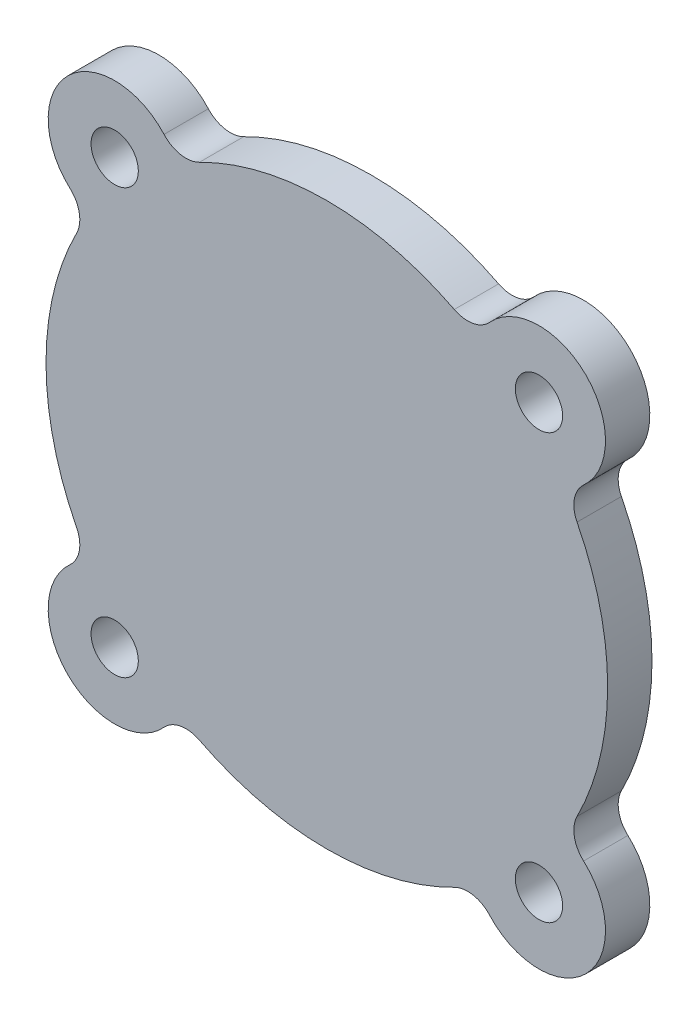
ISO-10303-21;
HEADER;
FILE_DESCRIPTION(('STEP AP214'),'2;1');
FILE_NAME('part.step','',(''),(''),'','','');
FILE_SCHEMA(('AUTOMOTIVE_DESIGN { 1 0 10303 214 1 1 1 1 }'));
ENDSEC;
DATA;
#1=APPLICATION_CONTEXT('core data for automotive mechanical design processes');
#2=APPLICATION_PROTOCOL_DEFINITION('international standard','automotive_design',2000,#1);
#3=PRODUCT_CONTEXT('',#1,'mechanical');
#4=PRODUCT('Part','Part','',(#3));
#5=PRODUCT_RELATED_PRODUCT_CATEGORY('part','',(#4));
#6=PRODUCT_DEFINITION_FORMATION('','',#4);
#7=PRODUCT_DEFINITION_CONTEXT('part definition',#1,'design');
#8=PRODUCT_DEFINITION('design','',#6,#7);
#9=PRODUCT_DEFINITION_SHAPE('','',#8);
#10=(LENGTH_UNIT() NAMED_UNIT(*) SI_UNIT(.MILLI.,.METRE.));
#11=(NAMED_UNIT(*) PLANE_ANGLE_UNIT() SI_UNIT($,.RADIAN.));
#12=(NAMED_UNIT(*) SI_UNIT($,.STERADIAN.) SOLID_ANGLE_UNIT());
#13=UNCERTAINTY_MEASURE_WITH_UNIT(LENGTH_MEASURE(1.E-05),#10,'distance_accuracy_value','');
#14=(GEOMETRIC_REPRESENTATION_CONTEXT(3) GLOBAL_UNCERTAINTY_ASSIGNED_CONTEXT((#13)) GLOBAL_UNIT_ASSIGNED_CONTEXT((#10,
#11,#12)) REPRESENTATION_CONTEXT('',''));
#15=CARTESIAN_POINT('',(0.,0.,0.));
#16=DIRECTION('',(0.,0.,1.));
#17=DIRECTION('',(1.,0.,0.));
#18=AXIS2_PLACEMENT_3D('',#15,#16,#17);
#19=CARTESIAN_POINT('',(0.,0.,3.));
#20=DIRECTION('',(0.,0.,-1.));
#21=DIRECTION('',(-1.,0.,0.));
#22=AXIS2_PLACEMENT_3D('',#19,#20,#21);
#23=CYLINDRICAL_SURFACE('',#22,19.);
#24=CARTESIAN_POINT('',(0.,0.,3.));
#25=DIRECTION('',(0.,0.,1.));
#26=DIRECTION('',(1.,0.,0.));
#27=AXIS2_PLACEMENT_3D('',#24,#25,#26);
#28=CIRCLE('',#27,19.);
#29=CARTESIAN_POINT('',(-16.9301315758226,8.62384165122102,3.));
#30=VERTEX_POINT('',#29);
#31=CARTESIAN_POINT('',(-16.9301315758226,-8.62384165122109,3.));
#32=VERTEX_POINT('',#31);
#33=EDGE_CURVE('E192',#30,#32,#28,.T.);
#34=ORIENTED_EDGE('',*,*,#33,.F.);
#35=DIRECTION('',(0.,0.,-1.));
#36=VECTOR('',#35,1.);
#37=CARTESIAN_POINT('',(-16.9301315758226,8.62384165122102,3.));
#38=LINE('',#37,#36);
#39=CARTESIAN_POINT('',(-16.9301315758226,8.62384165122102,0.));
#40=VERTEX_POINT('',#39);
#41=EDGE_CURVE('E214',#30,#40,#38,.T.);
#42=ORIENTED_EDGE('',*,*,#41,.T.);
#43=CARTESIAN_POINT('',(0.,0.,0.));
#44=DIRECTION('',(0.,0.,1.));
#45=DIRECTION('',(1.,0.,0.));
#46=AXIS2_PLACEMENT_3D('',#43,#44,#45);
#47=CIRCLE('',#46,19.);
#48=CARTESIAN_POINT('',(-16.9301315758226,-8.62384165122109,0.));
#49=VERTEX_POINT('',#48);
#50=EDGE_CURVE('E272',#40,#49,#47,.T.);
#51=ORIENTED_EDGE('',*,*,#50,.T.);
#52=DIRECTION('',(0.,0.,-1.));
#53=VECTOR('',#52,1.);
#54=CARTESIAN_POINT('',(-16.9301315758226,-8.62384165122109,3.));
#55=LINE('',#54,#53);
#56=EDGE_CURVE('E211',#49,#32,#55,.F.);
#57=ORIENTED_EDGE('',*,*,#56,.T.);
#58=EDGE_LOOP('',(#34,#42,#51,#57));
#59=FACE_BOUND('',#58,.T.);
#60=ADVANCED_FACE('F47',(#59),#23,.T.);
#61=CARTESIAN_POINT('',(-8.62384165122102,-16.9301315758226,0.));
#62=VERTEX_POINT('',#61);
#63=CARTESIAN_POINT('',(8.62384165122108,-16.9301315758226,0.));
#64=VERTEX_POINT('',#63);
#65=EDGE_CURVE('E254',#62,#64,#47,.T.);
#66=ORIENTED_EDGE('',*,*,#65,.T.);
#67=DIRECTION('',(0.,0.,-1.));
#68=VECTOR('',#67,1.);
#69=CARTESIAN_POINT('',(8.62384165122108,-16.9301315758226,3.));
#70=LINE('',#69,#68);
#71=CARTESIAN_POINT('',(8.62384165122108,-16.9301315758226,3.));
#72=VERTEX_POINT('',#71);
#73=EDGE_CURVE('E223',#64,#72,#70,.F.);
#74=ORIENTED_EDGE('',*,*,#73,.T.);
#75=CARTESIAN_POINT('',(-8.62384165122102,-16.9301315758226,3.));
#76=VERTEX_POINT('',#75);
#77=EDGE_CURVE('E184',#76,#72,#28,.T.);
#78=ORIENTED_EDGE('',*,*,#77,.F.);
#79=DIRECTION('',(0.,0.,-1.));
#80=VECTOR('',#79,1.);
#81=CARTESIAN_POINT('',(-8.62384165122102,-16.9301315758226,3.));
#82=LINE('',#81,#80);
#83=EDGE_CURVE('E221',#76,#62,#82,.T.);
#84=ORIENTED_EDGE('',*,*,#83,.T.);
#85=EDGE_LOOP('',(#66,#74,#78,#84));
#86=FACE_BOUND('',#85,.T.);
#87=ADVANCED_FACE('F266',(#86),#23,.T.);
#88=CARTESIAN_POINT('',(16.9301315758226,-8.62384165122102,3.));
#89=VERTEX_POINT('',#88);
#90=CARTESIAN_POINT('',(16.9301315758226,8.62384165122109,3.));
#91=VERTEX_POINT('',#90);
#92=EDGE_CURVE('E166',#89,#91,#28,.T.);
#93=ORIENTED_EDGE('',*,*,#92,.F.);
#94=DIRECTION('',(0.,0.,-1.));
#95=VECTOR('',#94,1.);
#96=CARTESIAN_POINT('',(16.9301315758226,-8.62384165122102,3.));
#97=LINE('',#96,#95);
#98=CARTESIAN_POINT('',(16.9301315758226,-8.62384165122102,0.));
#99=VERTEX_POINT('',#98);
#100=EDGE_CURVE('E180',#89,#99,#97,.T.);
#101=ORIENTED_EDGE('',*,*,#100,.T.);
#102=CARTESIAN_POINT('',(16.9301315758226,8.62384165122109,0.));
#103=VERTEX_POINT('',#102);
#104=EDGE_CURVE('E273',#99,#103,#47,.T.);
#105=ORIENTED_EDGE('',*,*,#104,.T.);
#106=DIRECTION('',(0.,0.,-1.));
#107=VECTOR('',#106,1.);
#108=CARTESIAN_POINT('',(16.9301315758226,8.62384165122109,3.));
#109=LINE('',#108,#107);
#110=EDGE_CURVE('E183',#103,#91,#109,.F.);
#111=ORIENTED_EDGE('',*,*,#110,.T.);
#112=EDGE_LOOP('',(#93,#101,#105,#111));
#113=FACE_BOUND('',#112,.T.);
#114=ADVANCED_FACE('F178',(#113),#23,.T.);
#115=CARTESIAN_POINT('',(8.62384165122102,16.9301315758226,3.));
#116=VERTEX_POINT('',#115);
#117=CARTESIAN_POINT('',(-8.62384165122109,16.9301315758226,3.));
#118=VERTEX_POINT('',#117);
#119=EDGE_CURVE('E185',#116,#118,#28,.T.);
#120=ORIENTED_EDGE('',*,*,#119,.F.);
#121=DIRECTION('',(0.,0.,-1.));
#122=VECTOR('',#121,1.);
#123=CARTESIAN_POINT('',(8.62384165122102,16.9301315758226,3.));
#124=LINE('',#123,#122);
#125=CARTESIAN_POINT('',(8.62384165122102,16.9301315758226,0.));
#126=VERTEX_POINT('',#125);
#127=EDGE_CURVE('E204',#116,#126,#124,.T.);
#128=ORIENTED_EDGE('',*,*,#127,.T.);
#129=CARTESIAN_POINT('',(-8.62384165122109,16.9301315758226,0.));
#130=VERTEX_POINT('',#129);
#131=EDGE_CURVE('E275',#126,#130,#47,.T.);
#132=ORIENTED_EDGE('',*,*,#131,.T.);
#133=DIRECTION('',(0.,0.,-1.));
#134=VECTOR('',#133,1.);
#135=CARTESIAN_POINT('',(-8.62384165122109,16.9301315758226,3.));
#136=LINE('',#135,#134);
#137=EDGE_CURVE('E201',#130,#118,#136,.F.);
#138=ORIENTED_EDGE('',*,*,#137,.T.);
#139=EDGE_LOOP('',(#120,#128,#132,#138));
#140=FACE_BOUND('',#139,.T.);
#141=ADVANCED_FACE('F336',(#140),#23,.T.);
#142=CARTESIAN_POINT('',(0.,0.,3.));
#143=DIRECTION('',(0.,0.,1.));
#144=DIRECTION('',(1.,0.,0.));
#145=AXIS2_PLACEMENT_3D('',#142,#143,#144);
#146=PLANE('',#145);
#147=CARTESIAN_POINT('',(-14.3542676580869,14.3542676580869,3.));
#148=DIRECTION('',(0.,0.,1.));
#149=DIRECTION('',(1.,0.,0.));
#150=AXIS2_PLACEMENT_3D('',#147,#148,#149);
#151=CIRCLE('',#150,1.6);
#152=CARTESIAN_POINT('',(-12.7542676580869,14.3542676580869,3.));
#153=VERTEX_POINT('',#152);
#154=EDGE_CURVE('E328',#153,#153,#151,.T.);
#155=ORIENTED_EDGE('',*,*,#154,.F.);
#156=EDGE_LOOP('',(#155));
#157=FACE_BOUND('',#156,.T.);
#158=CARTESIAN_POINT('',(-14.3542676580869,-14.3542676580869,3.));
#159=DIRECTION('',(0.,0.,1.));
#160=DIRECTION('',(1.,0.,0.));
#161=AXIS2_PLACEMENT_3D('',#158,#159,#160);
#162=CIRCLE('',#161,1.6);
#163=CARTESIAN_POINT('',(-12.7542676580869,-14.3542676580869,3.));
#164=VERTEX_POINT('',#163);
#165=EDGE_CURVE('E322',#164,#164,#162,.T.);
#166=ORIENTED_EDGE('',*,*,#165,.F.);
#167=EDGE_LOOP('',(#166));
#168=FACE_BOUND('',#167,.T.);
#169=CARTESIAN_POINT('',(14.3542676580869,14.3542676580869,3.));
#170=DIRECTION('',(0.,0.,1.));
#171=DIRECTION('',(1.,0.,0.));
#172=AXIS2_PLACEMENT_3D('',#169,#170,#171);
#173=CIRCLE('',#172,1.6);
#174=CARTESIAN_POINT('',(15.9542676580869,14.3542676580869,3.));
#175=VERTEX_POINT('',#174);
#176=EDGE_CURVE('E316',#175,#175,#173,.T.);
#177=ORIENTED_EDGE('',*,*,#176,.F.);
#178=EDGE_LOOP('',(#177));
#179=FACE_BOUND('',#178,.T.);
#180=CARTESIAN_POINT('',(14.3542676580869,-14.3542676580869,3.));
#181=DIRECTION('',(0.,0.,1.));
#182=DIRECTION('',(1.,0.,0.));
#183=AXIS2_PLACEMENT_3D('',#180,#181,#182);
#184=CIRCLE('',#183,1.6);
#185=CARTESIAN_POINT('',(15.9542676580869,-14.3542676580869,3.));
#186=VERTEX_POINT('',#185);
#187=EDGE_CURVE('E310',#186,#186,#184,.T.);
#188=ORIENTED_EDGE('',*,*,#187,.F.);
#189=EDGE_LOOP('',(#188));
#190=FACE_BOUND('',#189,.T.);
#191=CARTESIAN_POINT('',(-14.3542676580869,14.3542676580869,3.));
#192=DIRECTION('',(0.,0.,1.));
#193=DIRECTION('',(1.,0.,0.));
#194=AXIS2_PLACEMENT_3D('',#191,#192,#193);
#195=CIRCLE('',#194,4.5);
#196=CARTESIAN_POINT('',(-11.0155077493741,17.3713328333808,3.));
#197=VERTEX_POINT('',#196);
#198=CARTESIAN_POINT('',(-17.3713328333809,11.015507749374,3.));
#199=VERTEX_POINT('',#198);
#200=EDGE_CURVE('E295',#197,#199,#195,.T.);
#201=ORIENTED_EDGE('',*,*,#200,.T.);
#202=CARTESIAN_POINT('',(-18.7122506890671,9.53161445661271,3.));
#203=DIRECTION('',(0.,0.,1.));
#204=DIRECTION('',(1.,0.,0.));
#205=AXIS2_PLACEMENT_3D('',#202,#203,#204);
#206=CIRCLE('',#205,2.);
#207=EDGE_CURVE('E240',#199,#30,#206,.F.);
#208=ORIENTED_EDGE('',*,*,#207,.T.);
#209=ORIENTED_EDGE('',*,*,#33,.T.);
#210=CARTESIAN_POINT('',(-18.712250689067,-9.53161445661278,3.));
#211=DIRECTION('',(0.,0.,1.));
#212=DIRECTION('',(1.,0.,0.));
#213=AXIS2_PLACEMENT_3D('',#210,#211,#212);
#214=CIRCLE('',#213,2.);
#215=CARTESIAN_POINT('',(-17.3713328333808,-11.0155077493741,3.));
#216=VERTEX_POINT('',#215);
#217=EDGE_CURVE('E242',#32,#216,#214,.F.);
#218=ORIENTED_EDGE('',*,*,#217,.T.);
#219=CARTESIAN_POINT('',(-14.3542676580869,-14.3542676580869,3.));
#220=DIRECTION('',(0.,0.,1.));
#221=DIRECTION('',(1.,0.,0.));
#222=AXIS2_PLACEMENT_3D('',#219,#220,#221);
#223=CIRCLE('',#222,4.5);
#224=CARTESIAN_POINT('',(-11.015507749374,-17.3713328333809,3.));
#225=VERTEX_POINT('',#224);
#226=EDGE_CURVE('E260',#216,#225,#223,.T.);
#227=ORIENTED_EDGE('',*,*,#226,.T.);
#228=CARTESIAN_POINT('',(-9.5316144566127,-18.7122506890671,3.));
#229=DIRECTION('',(0.,0.,1.));
#230=DIRECTION('',(1.,0.,0.));
#231=AXIS2_PLACEMENT_3D('',#228,#229,#230);
#232=CIRCLE('',#231,2.);
#233=EDGE_CURVE('E13',#225,#76,#232,.F.);
#234=ORIENTED_EDGE('',*,*,#233,.T.);
#235=ORIENTED_EDGE('',*,*,#77,.T.);
#236=CARTESIAN_POINT('',(9.53161445661278,-18.712250689067,3.));
#237=DIRECTION('',(0.,0.,1.));
#238=DIRECTION('',(1.,0.,0.));
#239=AXIS2_PLACEMENT_3D('',#236,#237,#238);
#240=CIRCLE('',#239,2.);
#241=CARTESIAN_POINT('',(11.0155077493741,-17.3713328333808,3.));
#242=VERTEX_POINT('',#241);
#243=EDGE_CURVE('E246',#72,#242,#240,.F.);
#244=ORIENTED_EDGE('',*,*,#243,.T.);
#245=CARTESIAN_POINT('',(14.3542676580869,-14.3542676580869,3.));
#246=DIRECTION('',(0.,0.,1.));
#247=DIRECTION('',(1.,0.,0.));
#248=AXIS2_PLACEMENT_3D('',#245,#246,#247);
#249=CIRCLE('',#248,4.5);
#250=CARTESIAN_POINT('',(17.3713328333809,-11.015507749374,3.));
#251=VERTEX_POINT('',#250);
#252=EDGE_CURVE('E168',#242,#251,#249,.T.);
#253=ORIENTED_EDGE('',*,*,#252,.T.);
#254=CARTESIAN_POINT('',(18.7122506890671,-9.5316144566127,3.));
#255=DIRECTION('',(0.,0.,1.));
#256=DIRECTION('',(1.,0.,0.));
#257=AXIS2_PLACEMENT_3D('',#254,#255,#256);
#258=CIRCLE('',#257,2.);
#259=EDGE_CURVE('E162',#251,#89,#258,.F.);
#260=ORIENTED_EDGE('',*,*,#259,.T.);
#261=ORIENTED_EDGE('',*,*,#92,.T.);
#262=CARTESIAN_POINT('',(18.712250689067,9.53161445661279,3.));
#263=DIRECTION('',(0.,0.,1.));
#264=DIRECTION('',(1.,0.,0.));
#265=AXIS2_PLACEMENT_3D('',#262,#263,#264);
#266=CIRCLE('',#265,2.);
#267=CARTESIAN_POINT('',(17.3713328333808,11.0155077493741,3.));
#268=VERTEX_POINT('',#267);
#269=EDGE_CURVE('E172',#91,#268,#266,.F.);
#270=ORIENTED_EDGE('',*,*,#269,.T.);
#271=CARTESIAN_POINT('',(14.3542676580869,14.3542676580869,3.));
#272=DIRECTION('',(0.,0.,1.));
#273=DIRECTION('',(1.,0.,0.));
#274=AXIS2_PLACEMENT_3D('',#271,#272,#273);
#275=CIRCLE('',#274,4.5);
#276=CARTESIAN_POINT('',(11.015507749374,17.3713328333809,3.));
#277=VERTEX_POINT('',#276);
#278=EDGE_CURVE('E300',#268,#277,#275,.T.);
#279=ORIENTED_EDGE('',*,*,#278,.T.);
#280=CARTESIAN_POINT('',(9.53161445661271,18.7122506890671,3.));
#281=DIRECTION('',(0.,0.,1.));
#282=DIRECTION('',(1.,0.,0.));
#283=AXIS2_PLACEMENT_3D('',#280,#281,#282);
#284=CIRCLE('',#283,2.);
#285=EDGE_CURVE('E232',#277,#116,#284,.F.);
#286=ORIENTED_EDGE('',*,*,#285,.T.);
#287=ORIENTED_EDGE('',*,*,#119,.T.);
#288=CARTESIAN_POINT('',(-9.53161445661278,18.712250689067,3.));
#289=DIRECTION('',(0.,0.,1.));
#290=DIRECTION('',(1.,0.,0.));
#291=AXIS2_PLACEMENT_3D('',#288,#289,#290);
#292=CIRCLE('',#291,2.);
#293=EDGE_CURVE('E234',#118,#197,#292,.F.);
#294=ORIENTED_EDGE('',*,*,#293,.T.);
#295=EDGE_LOOP('',(#201,#208,#209,#218,#227,#234,#235,#244,#253,#260,#261,#270,#279,#286,#287,#294));
#296=FACE_BOUND('',#295,.T.);
#297=ADVANCED_FACE('F165',(#157,#168,#179,#190,#296),#146,.T.);
#298=CARTESIAN_POINT('',(0.,0.,0.));
#299=DIRECTION('',(0.,0.,1.));
#300=DIRECTION('',(1.,0.,0.));
#301=AXIS2_PLACEMENT_3D('',#298,#299,#300);
#302=PLANE('',#301);
#303=CARTESIAN_POINT('',(-14.3542676580869,14.3542676580869,0.));
#304=DIRECTION('',(0.,0.,1.));
#305=DIRECTION('',(1.,0.,0.));
#306=AXIS2_PLACEMENT_3D('',#303,#304,#305);
#307=CIRCLE('',#306,1.6);
#308=CARTESIAN_POINT('',(-12.7542676580869,14.3542676580869,0.));
#309=VERTEX_POINT('',#308);
#310=EDGE_CURVE('E325',#309,#309,#307,.T.);
#311=ORIENTED_EDGE('',*,*,#310,.T.);
#312=EDGE_LOOP('',(#311));
#313=FACE_BOUND('',#312,.T.);
#314=CARTESIAN_POINT('',(-14.3542676580869,-14.3542676580869,0.));
#315=DIRECTION('',(0.,0.,1.));
#316=DIRECTION('',(1.,0.,0.));
#317=AXIS2_PLACEMENT_3D('',#314,#315,#316);
#318=CIRCLE('',#317,1.6);
#319=CARTESIAN_POINT('',(-12.7542676580869,-14.3542676580869,0.));
#320=VERTEX_POINT('',#319);
#321=EDGE_CURVE('E319',#320,#320,#318,.T.);
#322=ORIENTED_EDGE('',*,*,#321,.T.);
#323=EDGE_LOOP('',(#322));
#324=FACE_BOUND('',#323,.T.);
#325=CARTESIAN_POINT('',(14.3542676580869,14.3542676580869,0.));
#326=DIRECTION('',(0.,0.,1.));
#327=DIRECTION('',(1.,0.,0.));
#328=AXIS2_PLACEMENT_3D('',#325,#326,#327);
#329=CIRCLE('',#328,1.6);
#330=CARTESIAN_POINT('',(15.9542676580869,14.3542676580869,0.));
#331=VERTEX_POINT('',#330);
#332=EDGE_CURVE('E313',#331,#331,#329,.T.);
#333=ORIENTED_EDGE('',*,*,#332,.T.);
#334=EDGE_LOOP('',(#333));
#335=FACE_BOUND('',#334,.T.);
#336=CARTESIAN_POINT('',(14.3542676580869,-14.3542676580869,0.));
#337=DIRECTION('',(0.,0.,1.));
#338=DIRECTION('',(1.,0.,0.));
#339=AXIS2_PLACEMENT_3D('',#336,#337,#338);
#340=CIRCLE('',#339,1.6);
#341=CARTESIAN_POINT('',(15.9542676580869,-14.3542676580869,0.));
#342=VERTEX_POINT('',#341);
#343=EDGE_CURVE('E307',#342,#342,#340,.T.);
#344=ORIENTED_EDGE('',*,*,#343,.T.);
#345=EDGE_LOOP('',(#344));
#346=FACE_BOUND('',#345,.T.);
#347=ORIENTED_EDGE('',*,*,#65,.F.);
#348=CARTESIAN_POINT('',(-9.5316144566127,-18.7122506890671,0.));
#349=DIRECTION('',(0.,0.,1.));
#350=DIRECTION('',(1.,0.,0.));
#351=AXIS2_PLACEMENT_3D('',#348,#349,#350);
#352=CIRCLE('',#351,2.);
#353=CARTESIAN_POINT('',(-11.015507749374,-17.3713328333809,0.));
#354=VERTEX_POINT('',#353);
#355=EDGE_CURVE('E55',#62,#354,#352,.T.);
#356=ORIENTED_EDGE('',*,*,#355,.T.);
#357=CARTESIAN_POINT('',(-14.3542676580869,-14.3542676580869,0.));
#358=DIRECTION('',(0.,0.,1.));
#359=DIRECTION('',(1.,0.,0.));
#360=AXIS2_PLACEMENT_3D('',#357,#358,#359);
#361=CIRCLE('',#360,4.5);
#362=CARTESIAN_POINT('',(-17.3713328333808,-11.0155077493741,0.));
#363=VERTEX_POINT('',#362);
#364=EDGE_CURVE('E252',#354,#363,#361,.F.);
#365=ORIENTED_EDGE('',*,*,#364,.T.);
#366=CARTESIAN_POINT('',(-18.712250689067,-9.53161445661278,0.));
#367=DIRECTION('',(0.,0.,1.));
#368=DIRECTION('',(1.,0.,0.));
#369=AXIS2_PLACEMENT_3D('',#366,#367,#368);
#370=CIRCLE('',#369,2.);
#371=EDGE_CURVE('E244',#363,#49,#370,.T.);
#372=ORIENTED_EDGE('',*,*,#371,.T.);
#373=ORIENTED_EDGE('',*,*,#50,.F.);
#374=CARTESIAN_POINT('',(-18.7122506890671,9.53161445661271,0.));
#375=DIRECTION('',(0.,0.,1.));
#376=DIRECTION('',(1.,0.,0.));
#377=AXIS2_PLACEMENT_3D('',#374,#375,#376);
#378=CIRCLE('',#377,2.);
#379=CARTESIAN_POINT('',(-17.3713328333809,11.015507749374,0.));
#380=VERTEX_POINT('',#379);
#381=EDGE_CURVE('E238',#40,#380,#378,.T.);
#382=ORIENTED_EDGE('',*,*,#381,.T.);
#383=CARTESIAN_POINT('',(-14.3542676580869,14.3542676580869,0.));
#384=DIRECTION('',(0.,0.,1.));
#385=DIRECTION('',(1.,0.,0.));
#386=AXIS2_PLACEMENT_3D('',#383,#384,#385);
#387=CIRCLE('',#386,4.5);
#388=CARTESIAN_POINT('',(-11.0155077493741,17.3713328333808,0.));
#389=VERTEX_POINT('',#388);
#390=EDGE_CURVE('E290',#380,#389,#387,.F.);
#391=ORIENTED_EDGE('',*,*,#390,.T.);
#392=CARTESIAN_POINT('',(-9.53161445661278,18.712250689067,0.));
#393=DIRECTION('',(0.,0.,1.));
#394=DIRECTION('',(1.,0.,0.));
#395=AXIS2_PLACEMENT_3D('',#392,#393,#394);
#396=CIRCLE('',#395,2.);
#397=EDGE_CURVE('E236',#389,#130,#396,.T.);
#398=ORIENTED_EDGE('',*,*,#397,.T.);
#399=ORIENTED_EDGE('',*,*,#131,.F.);
#400=CARTESIAN_POINT('',(9.53161445661271,18.7122506890671,0.));
#401=DIRECTION('',(0.,0.,1.));
#402=DIRECTION('',(1.,0.,0.));
#403=AXIS2_PLACEMENT_3D('',#400,#401,#402);
#404=CIRCLE('',#403,2.);
#405=CARTESIAN_POINT('',(11.015507749374,17.3713328333809,0.));
#406=VERTEX_POINT('',#405);
#407=EDGE_CURVE('E230',#126,#406,#404,.T.);
#408=ORIENTED_EDGE('',*,*,#407,.T.);
#409=CARTESIAN_POINT('',(14.3542676580869,14.3542676580869,0.));
#410=DIRECTION('',(0.,0.,1.));
#411=DIRECTION('',(1.,0.,0.));
#412=AXIS2_PLACEMENT_3D('',#409,#410,#411);
#413=CIRCLE('',#412,4.5);
#414=CARTESIAN_POINT('',(17.3713328333808,11.0155077493741,0.));
#415=VERTEX_POINT('',#414);
#416=EDGE_CURVE('E297',#406,#415,#413,.F.);
#417=ORIENTED_EDGE('',*,*,#416,.T.);
#418=CARTESIAN_POINT('',(18.712250689067,9.53161445661279,0.));
#419=DIRECTION('',(0.,0.,1.));
#420=DIRECTION('',(1.,0.,0.));
#421=AXIS2_PLACEMENT_3D('',#418,#419,#420);
#422=CIRCLE('',#421,2.);
#423=EDGE_CURVE('E228',#415,#103,#422,.T.);
#424=ORIENTED_EDGE('',*,*,#423,.T.);
#425=ORIENTED_EDGE('',*,*,#104,.F.);
#426=CARTESIAN_POINT('',(18.7122506890671,-9.5316144566127,0.));
#427=DIRECTION('',(0.,0.,1.));
#428=DIRECTION('',(1.,0.,0.));
#429=AXIS2_PLACEMENT_3D('',#426,#427,#428);
#430=CIRCLE('',#429,2.);
#431=CARTESIAN_POINT('',(17.3713328333809,-11.015507749374,0.));
#432=VERTEX_POINT('',#431);
#433=EDGE_CURVE('E173',#99,#432,#430,.T.);
#434=ORIENTED_EDGE('',*,*,#433,.T.);
#435=CARTESIAN_POINT('',(14.3542676580869,-14.3542676580869,0.));
#436=DIRECTION('',(0.,0.,1.));
#437=DIRECTION('',(1.,0.,0.));
#438=AXIS2_PLACEMENT_3D('',#435,#436,#437);
#439=CIRCLE('',#438,4.5);
#440=CARTESIAN_POINT('',(11.0155077493741,-17.3713328333808,0.));
#441=VERTEX_POINT('',#440);
#442=EDGE_CURVE('E303',#432,#441,#439,.F.);
#443=ORIENTED_EDGE('',*,*,#442,.T.);
#444=CARTESIAN_POINT('',(9.53161445661278,-18.712250689067,0.));
#445=DIRECTION('',(0.,0.,1.));
#446=DIRECTION('',(1.,0.,0.));
#447=AXIS2_PLACEMENT_3D('',#444,#445,#446);
#448=CIRCLE('',#447,2.);
#449=EDGE_CURVE('E62',#441,#64,#448,.T.);
#450=ORIENTED_EDGE('',*,*,#449,.T.);
#451=EDGE_LOOP('',(#347,#356,#365,#372,#373,#382,#391,#398,#399,#408,#417,#424,#425,#434,#443,#450));
#452=FACE_BOUND('',#451,.T.);
#453=CARTESIAN_POINT('',(0.,0.,0.));
#454=DIRECTION('',(0.,0.,-1.));
#455=DIRECTION('',(-1.,0.,0.));
#456=AXIS2_PLACEMENT_3D('',#453,#454,#455);
#457=CIRCLE('',#456,15.8);
#458=CARTESIAN_POINT('',(-15.8,0.,0.));
#459=VERTEX_POINT('',#458);
#460=EDGE_CURVE('E270',#459,#459,#457,.T.);
#461=ORIENTED_EDGE('',*,*,#460,.F.);
#462=EDGE_LOOP('',(#461));
#463=FACE_BOUND('',#462,.T.);
#464=ADVANCED_FACE('F250',(#313,#324,#335,#346,#452,#463),#302,.F.);
#465=CARTESIAN_POINT('',(0.,0.,2.4));
#466=DIRECTION('',(0.,0.,-1.));
#467=DIRECTION('',(-1.,0.,0.));
#468=AXIS2_PLACEMENT_3D('',#465,#466,#467);
#469=CYLINDRICAL_SURFACE('',#468,15.8);
#470=CARTESIAN_POINT('',(0.,0.,2.4));
#471=DIRECTION('',(0.,0.,-1.));
#472=DIRECTION('',(-1.,0.,0.));
#473=AXIS2_PLACEMENT_3D('',#470,#471,#472);
#474=CIRCLE('',#473,15.8);
#475=CARTESIAN_POINT('',(-15.8,0.,2.4));
#476=VERTEX_POINT('',#475);
#477=EDGE_CURVE('E277',#476,#476,#474,.T.);
#478=ORIENTED_EDGE('',*,*,#477,.F.);
#479=EDGE_LOOP('',(#478));
#480=FACE_BOUND('',#479,.T.);
#481=ORIENTED_EDGE('',*,*,#460,.T.);
#482=EDGE_LOOP('',(#481));
#483=FACE_BOUND('',#482,.T.);
#484=ADVANCED_FACE('F427',(#480,#483),#469,.F.);
#485=CARTESIAN_POINT('',(0.,0.,2.4));
#486=DIRECTION('',(0.,0.,-1.));
#487=DIRECTION('',(-1.,0.,0.));
#488=AXIS2_PLACEMENT_3D('',#485,#486,#487);
#489=PLANE('',#488);
#490=CARTESIAN_POINT('',(0.,0.,2.4));
#491=DIRECTION('',(0.,0.,-1.));
#492=DIRECTION('',(-1.,0.,0.));
#493=AXIS2_PLACEMENT_3D('',#490,#491,#492);
#494=CIRCLE('',#493,11.7);
#495=CARTESIAN_POINT('',(-11.7,0.,2.4));
#496=VERTEX_POINT('',#495);
#497=EDGE_CURVE('E285',#496,#496,#494,.T.);
#498=ORIENTED_EDGE('',*,*,#497,.F.);
#499=EDGE_LOOP('',(#498));
#500=FACE_BOUND('',#499,.T.);
#501=ORIENTED_EDGE('',*,*,#477,.T.);
#502=EDGE_LOOP('',(#501));
#503=FACE_BOUND('',#502,.T.);
#504=ADVANCED_FACE('F438',(#500,#503),#489,.T.);
#505=CARTESIAN_POINT('',(0.,0.,2.4));
#506=DIRECTION('',(0.,0.,-1.));
#507=DIRECTION('',(-1.,0.,0.));
#508=AXIS2_PLACEMENT_3D('',#505,#506,#507);
#509=CYLINDRICAL_SURFACE('',#508,11.7);
#510=ORIENTED_EDGE('',*,*,#497,.T.);
#511=EDGE_LOOP('',(#510));
#512=FACE_BOUND('',#511,.T.);
#513=CARTESIAN_POINT('',(0.,0.,0.));
#514=DIRECTION('',(0.,0.,-1.));
#515=DIRECTION('',(-1.,0.,0.));
#516=AXIS2_PLACEMENT_3D('',#513,#514,#515);
#517=CIRCLE('',#516,11.7);
#518=CARTESIAN_POINT('',(-11.7,0.,0.));
#519=VERTEX_POINT('',#518);
#520=EDGE_CURVE('E287',#519,#519,#517,.T.);
#521=ORIENTED_EDGE('',*,*,#520,.F.);
#522=EDGE_LOOP('',(#521));
#523=FACE_BOUND('',#522,.T.);
#524=ADVANCED_FACE('F443',(#512,#523),#509,.T.);
#525=ORIENTED_EDGE('',*,*,#520,.T.);
#526=EDGE_LOOP('',(#525));
#527=FACE_BOUND('',#526,.T.);
#528=ADVANCED_FACE('F428',(#527),#302,.F.);
#529=CARTESIAN_POINT('',(-14.3542676580869,14.3542676580869,-12.7279220613579));
#530=DIRECTION('',(0.,0.,1.));
#531=DIRECTION('',(1.,0.,0.));
#532=AXIS2_PLACEMENT_3D('',#529,#530,#531);
#533=CYLINDRICAL_SURFACE('',#532,4.5);
#534=ORIENTED_EDGE('',*,*,#200,.F.);
#535=DIRECTION('',(0.,0.,1.));
#536=VECTOR('',#535,1.);
#537=CARTESIAN_POINT('',(-11.0155077493741,17.3713328333808,-12.7279220613579));
#538=LINE('',#537,#536);
#539=EDGE_CURVE('E209',#197,#389,#538,.F.);
#540=ORIENTED_EDGE('',*,*,#539,.T.);
#541=ORIENTED_EDGE('',*,*,#390,.F.);
#542=DIRECTION('',(0.,0.,1.));
#543=VECTOR('',#542,1.);
#544=CARTESIAN_POINT('',(-17.3713328333809,11.015507749374,-12.7279220613579));
#545=LINE('',#544,#543);
#546=EDGE_CURVE('E207',#380,#199,#545,.T.);
#547=ORIENTED_EDGE('',*,*,#546,.T.);
#548=EDGE_LOOP('',(#534,#540,#541,#547));
#549=FACE_BOUND('',#548,.T.);
#550=ADVANCED_FACE('F442',(#549),#533,.T.);
#551=CARTESIAN_POINT('',(14.3542676580869,14.3542676580869,-12.7279220613579));
#552=DIRECTION('',(0.,0.,1.));
#553=DIRECTION('',(1.,0.,0.));
#554=AXIS2_PLACEMENT_3D('',#551,#552,#553);
#555=CYLINDRICAL_SURFACE('',#554,4.5);
#556=ORIENTED_EDGE('',*,*,#278,.F.);
#557=DIRECTION('',(0.,0.,1.));
#558=VECTOR('',#557,1.);
#559=CARTESIAN_POINT('',(17.3713328333808,11.0155077493741,-12.7279220613579));
#560=LINE('',#559,#558);
#561=EDGE_CURVE('E199',#268,#415,#560,.F.);
#562=ORIENTED_EDGE('',*,*,#561,.T.);
#563=ORIENTED_EDGE('',*,*,#416,.F.);
#564=DIRECTION('',(0.,0.,1.));
#565=VECTOR('',#564,1.);
#566=CARTESIAN_POINT('',(11.015507749374,17.3713328333809,-12.7279220613579));
#567=LINE('',#566,#565);
#568=EDGE_CURVE('E197',#406,#277,#567,.T.);
#569=ORIENTED_EDGE('',*,*,#568,.T.);
#570=EDGE_LOOP('',(#556,#562,#563,#569));
#571=FACE_BOUND('',#570,.T.);
#572=ADVANCED_FACE('F383',(#571),#555,.T.);
#573=CARTESIAN_POINT('',(14.3542676580869,-14.3542676580869,-12.7279220613579));
#574=DIRECTION('',(0.,0.,1.));
#575=DIRECTION('',(1.,0.,0.));
#576=AXIS2_PLACEMENT_3D('',#573,#574,#575);
#577=CYLINDRICAL_SURFACE('',#576,4.5);
#578=ORIENTED_EDGE('',*,*,#442,.F.);
#579=DIRECTION('',(0.,0.,1.));
#580=VECTOR('',#579,1.);
#581=CARTESIAN_POINT('',(17.3713328333809,-11.015507749374,-12.7279220613579));
#582=LINE('',#581,#580);
#583=EDGE_CURVE('E190',#432,#251,#582,.T.);
#584=ORIENTED_EDGE('',*,*,#583,.T.);
#585=ORIENTED_EDGE('',*,*,#252,.F.);
#586=DIRECTION('',(0.,0.,1.));
#587=VECTOR('',#586,1.);
#588=CARTESIAN_POINT('',(11.0155077493741,-17.3713328333808,-12.7279220613579));
#589=LINE('',#588,#587);
#590=EDGE_CURVE('E188',#242,#441,#589,.F.);
#591=ORIENTED_EDGE('',*,*,#590,.T.);
#592=EDGE_LOOP('',(#578,#584,#585,#591));
#593=FACE_BOUND('',#592,.T.);
#594=ADVANCED_FACE('F356',(#593),#577,.T.);
#595=CARTESIAN_POINT('',(-14.3542676580869,-14.3542676580869,-12.7279220613579));
#596=DIRECTION('',(0.,0.,1.));
#597=DIRECTION('',(1.,0.,0.));
#598=AXIS2_PLACEMENT_3D('',#595,#596,#597);
#599=CYLINDRICAL_SURFACE('',#598,4.5);
#600=ORIENTED_EDGE('',*,*,#226,.F.);
#601=DIRECTION('',(0.,0.,1.));
#602=VECTOR('',#601,1.);
#603=CARTESIAN_POINT('',(-17.3713328333808,-11.0155077493741,-12.7279220613579));
#604=LINE('',#603,#602);
#605=EDGE_CURVE('E219',#216,#363,#604,.F.);
#606=ORIENTED_EDGE('',*,*,#605,.T.);
#607=ORIENTED_EDGE('',*,*,#364,.F.);
#608=DIRECTION('',(0.,0.,1.));
#609=VECTOR('',#608,1.);
#610=CARTESIAN_POINT('',(-11.015507749374,-17.3713328333809,-12.7279220613579));
#611=LINE('',#610,#609);
#612=EDGE_CURVE('E217',#354,#225,#611,.T.);
#613=ORIENTED_EDGE('',*,*,#612,.T.);
#614=EDGE_LOOP('',(#600,#606,#607,#613));
#615=FACE_BOUND('',#614,.T.);
#616=ADVANCED_FACE('F257',(#615),#599,.T.);
#617=CARTESIAN_POINT('',(14.3542676580869,-14.3542676580869,3.));
#618=DIRECTION('',(0.,0.,1.));
#619=DIRECTION('',(1.,0.,0.));
#620=AXIS2_PLACEMENT_3D('',#617,#618,#619);
#621=CYLINDRICAL_SURFACE('',#620,1.6);
#622=ORIENTED_EDGE('',*,*,#343,.F.);
#623=EDGE_LOOP('',(#622));
#624=FACE_BOUND('',#623,.T.);
#625=ORIENTED_EDGE('',*,*,#187,.T.);
#626=EDGE_LOOP('',(#625));
#627=FACE_BOUND('',#626,.T.);
#628=ADVANCED_FACE('F344',(#624,#627),#621,.F.);
#629=CARTESIAN_POINT('',(14.3542676580869,14.3542676580869,3.));
#630=DIRECTION('',(0.,0.,1.));
#631=DIRECTION('',(1.,0.,0.));
#632=AXIS2_PLACEMENT_3D('',#629,#630,#631);
#633=CYLINDRICAL_SURFACE('',#632,1.6);
#634=ORIENTED_EDGE('',*,*,#332,.F.);
#635=EDGE_LOOP('',(#634));
#636=FACE_BOUND('',#635,.T.);
#637=ORIENTED_EDGE('',*,*,#176,.T.);
#638=EDGE_LOOP('',(#637));
#639=FACE_BOUND('',#638,.T.);
#640=ADVANCED_FACE('F346',(#636,#639),#633,.F.);
#641=CARTESIAN_POINT('',(-14.3542676580869,-14.3542676580869,3.));
#642=DIRECTION('',(0.,0.,1.));
#643=DIRECTION('',(1.,0.,0.));
#644=AXIS2_PLACEMENT_3D('',#641,#642,#643);
#645=CYLINDRICAL_SURFACE('',#644,1.6);
#646=ORIENTED_EDGE('',*,*,#321,.F.);
#647=EDGE_LOOP('',(#646));
#648=FACE_BOUND('',#647,.T.);
#649=ORIENTED_EDGE('',*,*,#165,.T.);
#650=EDGE_LOOP('',(#649));
#651=FACE_BOUND('',#650,.T.);
#652=ADVANCED_FACE('F353',(#648,#651),#645,.F.);
#653=CARTESIAN_POINT('',(-14.3542676580869,14.3542676580869,3.));
#654=DIRECTION('',(0.,0.,1.));
#655=DIRECTION('',(1.,0.,0.));
#656=AXIS2_PLACEMENT_3D('',#653,#654,#655);
#657=CYLINDRICAL_SURFACE('',#656,1.6);
#658=ORIENTED_EDGE('',*,*,#310,.F.);
#659=EDGE_LOOP('',(#658));
#660=FACE_BOUND('',#659,.T.);
#661=ORIENTED_EDGE('',*,*,#154,.T.);
#662=EDGE_LOOP('',(#661));
#663=FACE_BOUND('',#662,.T.);
#664=ADVANCED_FACE('F332',(#660,#663),#657,.F.);
#665=CARTESIAN_POINT('',(18.7122506890671,-9.5316144566127,-12.7279220613579));
#666=DIRECTION('',(0.,0.,1.));
#667=DIRECTION('',(1.,0.,0.));
#668=AXIS2_PLACEMENT_3D('',#665,#666,#667);
#669=CYLINDRICAL_SURFACE('',#668,2.);
#670=ORIENTED_EDGE('',*,*,#259,.F.);
#671=ORIENTED_EDGE('',*,*,#583,.F.);
#672=ORIENTED_EDGE('',*,*,#433,.F.);
#673=ORIENTED_EDGE('',*,*,#100,.F.);
#674=EDGE_LOOP('',(#670,#671,#672,#673));
#675=FACE_BOUND('',#674,.T.);
#676=ADVANCED_FACE('F187',(#675),#669,.F.);
#677=CARTESIAN_POINT('',(18.712250689067,9.53161445661279,-12.7279220613579));
#678=DIRECTION('',(0.,0.,-1.));
#679=DIRECTION('',(-1.,0.,0.));
#680=AXIS2_PLACEMENT_3D('',#677,#678,#679);
#681=CYLINDRICAL_SURFACE('',#680,2.);
#682=ORIENTED_EDGE('',*,*,#423,.F.);
#683=ORIENTED_EDGE('',*,*,#561,.F.);
#684=ORIENTED_EDGE('',*,*,#269,.F.);
#685=ORIENTED_EDGE('',*,*,#110,.F.);
#686=EDGE_LOOP('',(#682,#683,#684,#685));
#687=FACE_BOUND('',#686,.T.);
#688=ADVANCED_FACE('F386',(#687),#681,.F.);
#689=CARTESIAN_POINT('',(9.53161445661271,18.7122506890671,-12.7279220613579));
#690=DIRECTION('',(0.,0.,1.));
#691=DIRECTION('',(1.,0.,0.));
#692=AXIS2_PLACEMENT_3D('',#689,#690,#691);
#693=CYLINDRICAL_SURFACE('',#692,2.);
#694=ORIENTED_EDGE('',*,*,#285,.F.);
#695=ORIENTED_EDGE('',*,*,#568,.F.);
#696=ORIENTED_EDGE('',*,*,#407,.F.);
#697=ORIENTED_EDGE('',*,*,#127,.F.);
#698=EDGE_LOOP('',(#694,#695,#696,#697));
#699=FACE_BOUND('',#698,.T.);
#700=ADVANCED_FACE('F377',(#699),#693,.F.);
#701=CARTESIAN_POINT('',(-9.53161445661278,18.712250689067,-12.7279220613579));
#702=DIRECTION('',(0.,0.,-1.));
#703=DIRECTION('',(-1.,0.,0.));
#704=AXIS2_PLACEMENT_3D('',#701,#702,#703);
#705=CYLINDRICAL_SURFACE('',#704,2.);
#706=ORIENTED_EDGE('',*,*,#397,.F.);
#707=ORIENTED_EDGE('',*,*,#539,.F.);
#708=ORIENTED_EDGE('',*,*,#293,.F.);
#709=ORIENTED_EDGE('',*,*,#137,.F.);
#710=EDGE_LOOP('',(#706,#707,#708,#709));
#711=FACE_BOUND('',#710,.T.);
#712=ADVANCED_FACE('F404',(#711),#705,.F.);
#713=CARTESIAN_POINT('',(-18.7122506890671,9.53161445661271,-12.7279220613579));
#714=DIRECTION('',(0.,0.,1.));
#715=DIRECTION('',(1.,0.,0.));
#716=AXIS2_PLACEMENT_3D('',#713,#714,#715);
#717=CYLINDRICAL_SURFACE('',#716,2.);
#718=ORIENTED_EDGE('',*,*,#207,.F.);
#719=ORIENTED_EDGE('',*,*,#546,.F.);
#720=ORIENTED_EDGE('',*,*,#381,.F.);
#721=ORIENTED_EDGE('',*,*,#41,.F.);
#722=EDGE_LOOP('',(#718,#719,#720,#721));
#723=FACE_BOUND('',#722,.T.);
#724=ADVANCED_FACE('F398',(#723),#717,.F.);
#725=CARTESIAN_POINT('',(-18.712250689067,-9.53161445661278,-12.7279220613579));
#726=DIRECTION('',(0.,0.,-1.));
#727=DIRECTION('',(-1.,0.,0.));
#728=AXIS2_PLACEMENT_3D('',#725,#726,#727);
#729=CYLINDRICAL_SURFACE('',#728,2.);
#730=ORIENTED_EDGE('',*,*,#371,.F.);
#731=ORIENTED_EDGE('',*,*,#605,.F.);
#732=ORIENTED_EDGE('',*,*,#217,.F.);
#733=ORIENTED_EDGE('',*,*,#56,.F.);
#734=EDGE_LOOP('',(#730,#731,#732,#733));
#735=FACE_BOUND('',#734,.T.);
#736=ADVANCED_FACE('F393',(#735),#729,.F.);
#737=CARTESIAN_POINT('',(9.53161445661278,-18.712250689067,-12.7279220613579));
#738=DIRECTION('',(0.,0.,-1.));
#739=DIRECTION('',(-1.,0.,0.));
#740=AXIS2_PLACEMENT_3D('',#737,#738,#739);
#741=CYLINDRICAL_SURFACE('',#740,2.);
#742=ORIENTED_EDGE('',*,*,#449,.F.);
#743=ORIENTED_EDGE('',*,*,#590,.F.);
#744=ORIENTED_EDGE('',*,*,#243,.F.);
#745=ORIENTED_EDGE('',*,*,#73,.F.);
#746=EDGE_LOOP('',(#742,#743,#744,#745));
#747=FACE_BOUND('',#746,.T.);
#748=ADVANCED_FACE('F391',(#747),#741,.F.);
#749=CARTESIAN_POINT('',(-9.5316144566127,-18.7122506890671,-12.7279220613579));
#750=DIRECTION('',(0.,0.,1.));
#751=DIRECTION('',(1.,0.,0.));
#752=AXIS2_PLACEMENT_3D('',#749,#750,#751);
#753=CYLINDRICAL_SURFACE('',#752,2.);
#754=ORIENTED_EDGE('',*,*,#233,.F.);
#755=ORIENTED_EDGE('',*,*,#612,.F.);
#756=ORIENTED_EDGE('',*,*,#355,.F.);
#757=ORIENTED_EDGE('',*,*,#83,.F.);
#758=EDGE_LOOP('',(#754,#755,#756,#757));
#759=FACE_BOUND('',#758,.T.);
#760=ADVANCED_FACE('F49',(#759),#753,.F.);
#761=CLOSED_SHELL('',(#60,#87,#114,#141,#297,#464,#484,#504,#524,#528,#550,#572,#594,#616,#628,
#640,#652,#664,#676,#688,#700,#712,#724,#736,#748,#760));
#762=MANIFOLD_SOLID_BREP('B2',#761);
#763=ADVANCED_BREP_SHAPE_REPRESENTATION('',(#18,#762),#14);
#764=SHAPE_DEFINITION_REPRESENTATION(#9,#763);
ENDSEC;
END-ISO-10303-21;
